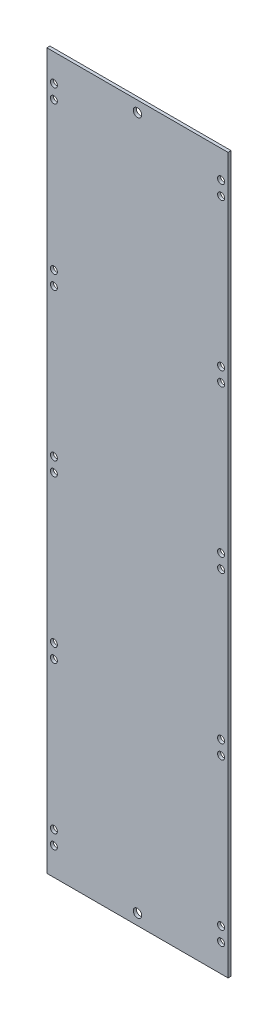
ISO-10303-21;
HEADER;
FILE_DESCRIPTION(('STEP AP214'),'2;1');
FILE_NAME('part.step','',(''),(''),'','','');
FILE_SCHEMA(('AUTOMOTIVE_DESIGN { 1 0 10303 214 1 1 1 1 }'));
ENDSEC;
DATA;
#1=APPLICATION_CONTEXT('core data for automotive mechanical design processes');
#2=APPLICATION_PROTOCOL_DEFINITION('international standard','automotive_design',2000,#1);
#3=PRODUCT_CONTEXT('',#1,'mechanical');
#4=PRODUCT('Part','Part','',(#3));
#5=PRODUCT_RELATED_PRODUCT_CATEGORY('part','',(#4));
#6=PRODUCT_DEFINITION_FORMATION('','',#4);
#7=PRODUCT_DEFINITION_CONTEXT('part definition',#1,'design');
#8=PRODUCT_DEFINITION('design','',#6,#7);
#9=PRODUCT_DEFINITION_SHAPE('','',#8);
#10=(LENGTH_UNIT() NAMED_UNIT(*) SI_UNIT(.MILLI.,.METRE.));
#11=(NAMED_UNIT(*) PLANE_ANGLE_UNIT() SI_UNIT($,.RADIAN.));
#12=(NAMED_UNIT(*) SI_UNIT($,.STERADIAN.) SOLID_ANGLE_UNIT());
#13=UNCERTAINTY_MEASURE_WITH_UNIT(LENGTH_MEASURE(1.E-05),#10,'distance_accuracy_value','');
#14=(GEOMETRIC_REPRESENTATION_CONTEXT(3) GLOBAL_UNCERTAINTY_ASSIGNED_CONTEXT((#13)) GLOBAL_UNIT_ASSIGNED_CONTEXT((#10,
#11,#12)) REPRESENTATION_CONTEXT('',''));
#15=CARTESIAN_POINT('',(0.,0.,0.));
#16=DIRECTION('',(0.,0.,1.));
#17=DIRECTION('',(1.,0.,0.));
#18=AXIS2_PLACEMENT_3D('',#15,#16,#17);
#19=CARTESIAN_POINT('',(0.,0.,1.397));
#20=DIRECTION('',(1.,0.,0.));
#21=DIRECTION('',(0.,0.,-1.));
#22=AXIS2_PLACEMENT_3D('',#19,#20,#21);
#23=PLANE('',#22);
#24=DIRECTION('',(0.,-1.,0.));
#25=VECTOR('',#24,1.);
#26=CARTESIAN_POINT('',(0.,0.,0.));
#27=LINE('',#26,#25);
#28=CARTESIAN_POINT('',(0.,327.5,0.));
#29=VERTEX_POINT('',#28);
#30=CARTESIAN_POINT('',(0.,0.,0.));
#31=VERTEX_POINT('',#30);
#32=EDGE_CURVE('E98',#29,#31,#27,.T.);
#33=ORIENTED_EDGE('',*,*,#32,.T.);
#34=DIRECTION('',(0.,0.,-1.));
#35=VECTOR('',#34,1.);
#36=CARTESIAN_POINT('',(0.,0.,1.397));
#37=LINE('',#36,#35);
#38=CARTESIAN_POINT('',(0.,0.,1.397));
#39=VERTEX_POINT('',#38);
#40=EDGE_CURVE('E11',#39,#31,#37,.T.);
#41=ORIENTED_EDGE('',*,*,#40,.F.);
#42=DIRECTION('',(0.,-1.,0.));
#43=VECTOR('',#42,1.);
#44=CARTESIAN_POINT('',(0.,0.,1.397));
#45=LINE('',#44,#43);
#46=CARTESIAN_POINT('',(0.,327.5,1.397));
#47=VERTEX_POINT('',#46);
#48=EDGE_CURVE('E86',#47,#39,#45,.T.);
#49=ORIENTED_EDGE('',*,*,#48,.F.);
#50=DIRECTION('',(0.,0.,-1.));
#51=VECTOR('',#50,1.);
#52=CARTESIAN_POINT('',(0.,327.5,1.397));
#53=LINE('',#52,#51);
#54=EDGE_CURVE('E94',#47,#29,#53,.T.);
#55=ORIENTED_EDGE('',*,*,#54,.T.);
#56=EDGE_LOOP('',(#33,#41,#49,#55));
#57=FACE_BOUND('',#56,.T.);
#58=ADVANCED_FACE('F35',(#57),#23,.F.);
#59=CARTESIAN_POINT('',(0.,0.,1.397));
#60=DIRECTION('',(0.,1.,0.));
#61=DIRECTION('',(0.,0.,1.));
#62=AXIS2_PLACEMENT_3D('',#59,#60,#61);
#63=PLANE('',#62);
#64=DIRECTION('',(1.,0.,0.));
#65=VECTOR('',#64,1.);
#66=CARTESIAN_POINT('',(0.,0.,0.));
#67=LINE('',#66,#65);
#68=CARTESIAN_POINT('',(83.,0.,0.));
#69=VERTEX_POINT('',#68);
#70=EDGE_CURVE('E90',#31,#69,#67,.T.);
#71=ORIENTED_EDGE('',*,*,#70,.T.);
#72=DIRECTION('',(0.,0.,-1.));
#73=VECTOR('',#72,1.);
#74=CARTESIAN_POINT('',(83.,0.,1.397));
#75=LINE('',#74,#73);
#76=CARTESIAN_POINT('',(83.,0.,1.397));
#77=VERTEX_POINT('',#76);
#78=EDGE_CURVE('E43',#77,#69,#75,.T.);
#79=ORIENTED_EDGE('',*,*,#78,.F.);
#80=DIRECTION('',(1.,0.,0.));
#81=VECTOR('',#80,1.);
#82=CARTESIAN_POINT('',(0.,0.,1.397));
#83=LINE('',#82,#81);
#84=EDGE_CURVE('E81',#39,#77,#83,.T.);
#85=ORIENTED_EDGE('',*,*,#84,.F.);
#86=ORIENTED_EDGE('',*,*,#40,.T.);
#87=EDGE_LOOP('',(#71,#79,#85,#86));
#88=FACE_BOUND('',#87,.T.);
#89=ADVANCED_FACE('F89',(#88),#63,.F.);
#90=CARTESIAN_POINT('',(83.,0.,1.397));
#91=DIRECTION('',(-1.,0.,0.));
#92=DIRECTION('',(0.,0.,1.));
#93=AXIS2_PLACEMENT_3D('',#90,#91,#92);
#94=PLANE('',#93);
#95=DIRECTION('',(0.,1.,0.));
#96=VECTOR('',#95,1.);
#97=CARTESIAN_POINT('',(83.,0.,0.));
#98=LINE('',#97,#96);
#99=CARTESIAN_POINT('',(83.,327.5,0.));
#100=VERTEX_POINT('',#99);
#101=EDGE_CURVE('E68',#69,#100,#98,.T.);
#102=ORIENTED_EDGE('',*,*,#101,.T.);
#103=DIRECTION('',(0.,0.,-1.));
#104=VECTOR('',#103,1.);
#105=CARTESIAN_POINT('',(83.,327.5,1.397));
#106=LINE('',#105,#104);
#107=CARTESIAN_POINT('',(83.,327.5,1.397));
#108=VERTEX_POINT('',#107);
#109=EDGE_CURVE('E91',#108,#100,#106,.T.);
#110=ORIENTED_EDGE('',*,*,#109,.F.);
#111=DIRECTION('',(0.,1.,0.));
#112=VECTOR('',#111,1.);
#113=CARTESIAN_POINT('',(83.,0.,1.397));
#114=LINE('',#113,#112);
#115=EDGE_CURVE('E84',#77,#108,#114,.T.);
#116=ORIENTED_EDGE('',*,*,#115,.F.);
#117=ORIENTED_EDGE('',*,*,#78,.T.);
#118=EDGE_LOOP('',(#102,#110,#116,#117));
#119=FACE_BOUND('',#118,.T.);
#120=ADVANCED_FACE('F92',(#119),#94,.F.);
#121=CARTESIAN_POINT('',(0.,327.5,1.397));
#122=DIRECTION('',(0.,-1.,0.));
#123=DIRECTION('',(0.,0.,-1.));
#124=AXIS2_PLACEMENT_3D('',#121,#122,#123);
#125=PLANE('',#124);
#126=DIRECTION('',(-1.,0.,0.));
#127=VECTOR('',#126,1.);
#128=CARTESIAN_POINT('',(0.,327.5,0.));
#129=LINE('',#128,#127);
#130=EDGE_CURVE('E74',#100,#29,#129,.T.);
#131=ORIENTED_EDGE('',*,*,#130,.T.);
#132=ORIENTED_EDGE('',*,*,#54,.F.);
#133=DIRECTION('',(-1.,0.,0.));
#134=VECTOR('',#133,1.);
#135=CARTESIAN_POINT('',(0.,327.5,1.397));
#136=LINE('',#135,#134);
#137=EDGE_CURVE('E51',#108,#47,#136,.T.);
#138=ORIENTED_EDGE('',*,*,#137,.F.);
#139=ORIENTED_EDGE('',*,*,#109,.T.);
#140=EDGE_LOOP('',(#131,#132,#138,#139));
#141=FACE_BOUND('',#140,.T.);
#142=ADVANCED_FACE('F106',(#141),#125,.F.);
#143=CARTESIAN_POINT('',(0.,0.,1.397));
#144=DIRECTION('',(0.,0.,-1.));
#145=DIRECTION('',(-1.,0.,0.));
#146=AXIS2_PLACEMENT_3D('',#143,#144,#145);
#147=PLANE('',#146);
#148=CARTESIAN_POINT('',(41.5,4.97599999999998,1.397));
#149=DIRECTION('',(0.,0.,1.));
#150=DIRECTION('',(1.,0.,0.));
#151=AXIS2_PLACEMENT_3D('',#148,#149,#150);
#152=CIRCLE('',#151,1.93);
#153=CARTESIAN_POINT('',(43.43,4.97599999999998,1.397));
#154=VERTEX_POINT('',#153);
#155=EDGE_CURVE('E238',#154,#154,#152,.T.);
#156=ORIENTED_EDGE('',*,*,#155,.F.);
#157=EDGE_LOOP('',(#156));
#158=FACE_BOUND('',#157,.T.);
#159=CARTESIAN_POINT('',(41.5,322.524,1.397));
#160=DIRECTION('',(0.,0.,1.));
#161=DIRECTION('',(1.,0.,0.));
#162=AXIS2_PLACEMENT_3D('',#159,#160,#161);
#163=CIRCLE('',#162,1.93);
#164=CARTESIAN_POINT('',(43.43,322.524,1.397));
#165=VERTEX_POINT('',#164);
#166=EDGE_CURVE('E232',#165,#165,#163,.T.);
#167=ORIENTED_EDGE('',*,*,#166,.F.);
#168=EDGE_LOOP('',(#167));
#169=FACE_BOUND('',#168,.T.);
#170=CARTESIAN_POINT('',(79.8000000000031,12.5999999999999,1.397));
#171=DIRECTION('',(0.,0.,1.));
#172=DIRECTION('',(1.,0.,0.));
#173=AXIS2_PLACEMENT_3D('',#170,#171,#172);
#174=CIRCLE('',#173,1.6);
#175=CARTESIAN_POINT('',(81.4000000000031,12.5999999999999,1.397));
#176=VERTEX_POINT('',#175);
#177=EDGE_CURVE('E226',#176,#176,#174,.T.);
#178=ORIENTED_EDGE('',*,*,#177,.F.);
#179=EDGE_LOOP('',(#178));
#180=FACE_BOUND('',#179,.T.);
#181=CARTESIAN_POINT('',(79.8000000000031,19.,1.397));
#182=DIRECTION('',(0.,0.,1.));
#183=DIRECTION('',(1.,0.,0.));
#184=AXIS2_PLACEMENT_3D('',#181,#182,#183);
#185=CIRCLE('',#184,1.6);
#186=CARTESIAN_POINT('',(81.4000000000031,19.,1.397));
#187=VERTEX_POINT('',#186);
#188=EDGE_CURVE('E220',#187,#187,#185,.T.);
#189=ORIENTED_EDGE('',*,*,#188,.F.);
#190=EDGE_LOOP('',(#189));
#191=FACE_BOUND('',#190,.T.);
#192=CARTESIAN_POINT('',(3.2000000000031,12.5999999999999,1.397));
#193=DIRECTION('',(0.,0.,1.));
#194=DIRECTION('',(1.,0.,0.));
#195=AXIS2_PLACEMENT_3D('',#192,#193,#194);
#196=CIRCLE('',#195,1.59999999999999);
#197=CARTESIAN_POINT('',(4.80000000000309,12.5999999999999,1.397));
#198=VERTEX_POINT('',#197);
#199=EDGE_CURVE('E214',#198,#198,#196,.T.);
#200=ORIENTED_EDGE('',*,*,#199,.F.);
#201=EDGE_LOOP('',(#200));
#202=FACE_BOUND('',#201,.T.);
#203=CARTESIAN_POINT('',(3.2000000000031,19.,1.397));
#204=DIRECTION('',(0.,0.,1.));
#205=DIRECTION('',(1.,0.,0.));
#206=AXIS2_PLACEMENT_3D('',#203,#204,#205);
#207=CIRCLE('',#206,1.59999999999999);
#208=CARTESIAN_POINT('',(4.80000000000309,19.,1.397));
#209=VERTEX_POINT('',#208);
#210=EDGE_CURVE('E208',#209,#209,#207,.T.);
#211=ORIENTED_EDGE('',*,*,#210,.F.);
#212=EDGE_LOOP('',(#211));
#213=FACE_BOUND('',#212,.T.);
#214=CARTESIAN_POINT('',(79.8000000000023,86.575,1.397));
#215=DIRECTION('',(0.,0.,1.));
#216=DIRECTION('',(1.,0.,0.));
#217=AXIS2_PLACEMENT_3D('',#214,#215,#216);
#218=CIRCLE('',#217,1.6);
#219=CARTESIAN_POINT('',(81.4000000000023,86.575,1.397));
#220=VERTEX_POINT('',#219);
#221=EDGE_CURVE('E202',#220,#220,#218,.T.);
#222=ORIENTED_EDGE('',*,*,#221,.F.);
#223=EDGE_LOOP('',(#222));
#224=FACE_BOUND('',#223,.T.);
#225=CARTESIAN_POINT('',(79.8000000000023,92.975,1.397));
#226=DIRECTION('',(0.,0.,1.));
#227=DIRECTION('',(1.,0.,0.));
#228=AXIS2_PLACEMENT_3D('',#225,#226,#227);
#229=CIRCLE('',#228,1.6);
#230=CARTESIAN_POINT('',(81.4000000000023,92.975,1.397));
#231=VERTEX_POINT('',#230);
#232=EDGE_CURVE('E196',#231,#231,#229,.T.);
#233=ORIENTED_EDGE('',*,*,#232,.F.);
#234=EDGE_LOOP('',(#233));
#235=FACE_BOUND('',#234,.T.);
#236=CARTESIAN_POINT('',(3.20000000000232,86.575,1.397));
#237=DIRECTION('',(0.,0.,1.));
#238=DIRECTION('',(1.,0.,0.));
#239=AXIS2_PLACEMENT_3D('',#236,#237,#238);
#240=CIRCLE('',#239,1.59999999999999);
#241=CARTESIAN_POINT('',(4.80000000000232,86.575,1.397));
#242=VERTEX_POINT('',#241);
#243=EDGE_CURVE('E190',#242,#242,#240,.T.);
#244=ORIENTED_EDGE('',*,*,#243,.F.);
#245=EDGE_LOOP('',(#244));
#246=FACE_BOUND('',#245,.T.);
#247=CARTESIAN_POINT('',(3.20000000000232,92.975,1.397));
#248=DIRECTION('',(0.,0.,1.));
#249=DIRECTION('',(1.,0.,0.));
#250=AXIS2_PLACEMENT_3D('',#247,#248,#249);
#251=CIRCLE('',#250,1.59999999999999);
#252=CARTESIAN_POINT('',(4.80000000000232,92.975,1.397));
#253=VERTEX_POINT('',#252);
#254=EDGE_CURVE('E184',#253,#253,#251,.T.);
#255=ORIENTED_EDGE('',*,*,#254,.F.);
#256=EDGE_LOOP('',(#255));
#257=FACE_BOUND('',#256,.T.);
#258=CARTESIAN_POINT('',(79.8000000000015,160.55,1.397));
#259=DIRECTION('',(0.,0.,1.));
#260=DIRECTION('',(1.,0.,0.));
#261=AXIS2_PLACEMENT_3D('',#258,#259,#260);
#262=CIRCLE('',#261,1.6);
#263=CARTESIAN_POINT('',(81.4000000000015,160.55,1.397));
#264=VERTEX_POINT('',#263);
#265=EDGE_CURVE('E178',#264,#264,#262,.T.);
#266=ORIENTED_EDGE('',*,*,#265,.F.);
#267=EDGE_LOOP('',(#266));
#268=FACE_BOUND('',#267,.T.);
#269=CARTESIAN_POINT('',(79.8000000000015,166.95,1.397));
#270=DIRECTION('',(0.,0.,1.));
#271=DIRECTION('',(1.,0.,0.));
#272=AXIS2_PLACEMENT_3D('',#269,#270,#271);
#273=CIRCLE('',#272,1.6);
#274=CARTESIAN_POINT('',(81.4000000000015,166.95,1.397));
#275=VERTEX_POINT('',#274);
#276=EDGE_CURVE('E172',#275,#275,#273,.T.);
#277=ORIENTED_EDGE('',*,*,#276,.F.);
#278=EDGE_LOOP('',(#277));
#279=FACE_BOUND('',#278,.T.);
#280=CARTESIAN_POINT('',(3.20000000000155,160.55,1.397));
#281=DIRECTION('',(0.,0.,1.));
#282=DIRECTION('',(1.,0.,0.));
#283=AXIS2_PLACEMENT_3D('',#280,#281,#282);
#284=CIRCLE('',#283,1.59999999999999);
#285=CARTESIAN_POINT('',(4.80000000000154,160.55,1.397));
#286=VERTEX_POINT('',#285);
#287=EDGE_CURVE('E166',#286,#286,#284,.T.);
#288=ORIENTED_EDGE('',*,*,#287,.F.);
#289=EDGE_LOOP('',(#288));
#290=FACE_BOUND('',#289,.T.);
#291=CARTESIAN_POINT('',(3.20000000000155,166.95,1.397));
#292=DIRECTION('',(0.,0.,1.));
#293=DIRECTION('',(1.,0.,0.));
#294=AXIS2_PLACEMENT_3D('',#291,#292,#293);
#295=CIRCLE('',#294,1.59999999999999);
#296=CARTESIAN_POINT('',(4.80000000000154,166.95,1.397));
#297=VERTEX_POINT('',#296);
#298=EDGE_CURVE('E160',#297,#297,#295,.T.);
#299=ORIENTED_EDGE('',*,*,#298,.F.);
#300=EDGE_LOOP('',(#299));
#301=FACE_BOUND('',#300,.T.);
#302=CARTESIAN_POINT('',(79.8000000000008,234.525,1.397));
#303=DIRECTION('',(0.,0.,1.));
#304=DIRECTION('',(1.,0.,0.));
#305=AXIS2_PLACEMENT_3D('',#302,#303,#304);
#306=CIRCLE('',#305,1.6);
#307=CARTESIAN_POINT('',(81.4000000000008,234.525,1.397));
#308=VERTEX_POINT('',#307);
#309=EDGE_CURVE('E154',#308,#308,#306,.T.);
#310=ORIENTED_EDGE('',*,*,#309,.F.);
#311=EDGE_LOOP('',(#310));
#312=FACE_BOUND('',#311,.T.);
#313=CARTESIAN_POINT('',(79.8000000000008,240.925,1.397));
#314=DIRECTION('',(0.,0.,1.));
#315=DIRECTION('',(1.,0.,0.));
#316=AXIS2_PLACEMENT_3D('',#313,#314,#315);
#317=CIRCLE('',#316,1.6);
#318=CARTESIAN_POINT('',(81.4000000000008,240.925,1.397));
#319=VERTEX_POINT('',#318);
#320=EDGE_CURVE('E148',#319,#319,#317,.T.);
#321=ORIENTED_EDGE('',*,*,#320,.F.);
#322=EDGE_LOOP('',(#321));
#323=FACE_BOUND('',#322,.T.);
#324=CARTESIAN_POINT('',(3.20000000000077,234.525,1.397));
#325=DIRECTION('',(0.,0.,1.));
#326=DIRECTION('',(1.,0.,0.));
#327=AXIS2_PLACEMENT_3D('',#324,#325,#326);
#328=CIRCLE('',#327,1.59999999999999);
#329=CARTESIAN_POINT('',(4.80000000000077,234.525,1.397));
#330=VERTEX_POINT('',#329);
#331=EDGE_CURVE('E142',#330,#330,#328,.T.);
#332=ORIENTED_EDGE('',*,*,#331,.F.);
#333=EDGE_LOOP('',(#332));
#334=FACE_BOUND('',#333,.T.);
#335=CARTESIAN_POINT('',(3.20000000000078,240.925,1.397));
#336=DIRECTION('',(0.,0.,1.));
#337=DIRECTION('',(1.,0.,0.));
#338=AXIS2_PLACEMENT_3D('',#335,#336,#337);
#339=CIRCLE('',#338,1.59999999999999);
#340=CARTESIAN_POINT('',(4.80000000000077,240.925,1.397));
#341=VERTEX_POINT('',#340);
#342=EDGE_CURVE('E136',#341,#341,#339,.T.);
#343=ORIENTED_EDGE('',*,*,#342,.F.);
#344=EDGE_LOOP('',(#343));
#345=FACE_BOUND('',#344,.T.);
#346=CARTESIAN_POINT('',(79.8,308.5,1.397));
#347=DIRECTION('',(0.,0.,1.));
#348=DIRECTION('',(1.,0.,0.));
#349=AXIS2_PLACEMENT_3D('',#346,#347,#348);
#350=CIRCLE('',#349,1.6);
#351=CARTESIAN_POINT('',(81.4,308.5,1.397));
#352=VERTEX_POINT('',#351);
#353=EDGE_CURVE('E130',#352,#352,#350,.T.);
#354=ORIENTED_EDGE('',*,*,#353,.F.);
#355=EDGE_LOOP('',(#354));
#356=FACE_BOUND('',#355,.T.);
#357=CARTESIAN_POINT('',(79.8,314.9,1.397));
#358=DIRECTION('',(0.,0.,1.));
#359=DIRECTION('',(1.,0.,0.));
#360=AXIS2_PLACEMENT_3D('',#357,#358,#359);
#361=CIRCLE('',#360,1.6);
#362=CARTESIAN_POINT('',(81.4,314.9,1.397));
#363=VERTEX_POINT('',#362);
#364=EDGE_CURVE('E124',#363,#363,#361,.T.);
#365=ORIENTED_EDGE('',*,*,#364,.F.);
#366=EDGE_LOOP('',(#365));
#367=FACE_BOUND('',#366,.T.);
#368=CARTESIAN_POINT('',(3.2,308.5,1.397));
#369=DIRECTION('',(0.,0.,1.));
#370=DIRECTION('',(1.,0.,0.));
#371=AXIS2_PLACEMENT_3D('',#368,#369,#370);
#372=CIRCLE('',#371,1.59999999999999);
#373=CARTESIAN_POINT('',(4.79999999999999,308.5,1.397));
#374=VERTEX_POINT('',#373);
#375=EDGE_CURVE('E118',#374,#374,#372,.T.);
#376=ORIENTED_EDGE('',*,*,#375,.F.);
#377=EDGE_LOOP('',(#376));
#378=FACE_BOUND('',#377,.T.);
#379=CARTESIAN_POINT('',(3.2,314.9,1.397));
#380=DIRECTION('',(0.,0.,1.));
#381=DIRECTION('',(1.,0.,0.));
#382=AXIS2_PLACEMENT_3D('',#379,#380,#381);
#383=CIRCLE('',#382,1.59999999999999);
#384=CARTESIAN_POINT('',(4.79999999999999,314.9,1.397));
#385=VERTEX_POINT('',#384);
#386=EDGE_CURVE('E112',#385,#385,#383,.T.);
#387=ORIENTED_EDGE('',*,*,#386,.F.);
#388=EDGE_LOOP('',(#387));
#389=FACE_BOUND('',#388,.T.);
#390=ORIENTED_EDGE('',*,*,#48,.T.);
#391=ORIENTED_EDGE('',*,*,#84,.T.);
#392=ORIENTED_EDGE('',*,*,#115,.T.);
#393=ORIENTED_EDGE('',*,*,#137,.T.);
#394=EDGE_LOOP('',(#390,#391,#392,#393));
#395=FACE_BOUND('',#394,.T.);
#396=ADVANCED_FACE('F82',(#158,#169,#180,#191,#202,#213,#224,#235,#246,#257,#268,#279,#290,#301,
#312,#323,#334,#345,#356,#367,#378,#389,#395),#147,.F.);
#397=CARTESIAN_POINT('',(0.,0.,0.));
#398=DIRECTION('',(0.,0.,-1.));
#399=DIRECTION('',(-1.,0.,0.));
#400=AXIS2_PLACEMENT_3D('',#397,#398,#399);
#401=PLANE('',#400);
#402=CARTESIAN_POINT('',(41.5,4.97599999999998,0.));
#403=DIRECTION('',(0.,0.,1.));
#404=DIRECTION('',(1.,0.,0.));
#405=AXIS2_PLACEMENT_3D('',#402,#403,#404);
#406=CIRCLE('',#405,1.93);
#407=CARTESIAN_POINT('',(43.43,4.97599999999998,0.));
#408=VERTEX_POINT('',#407);
#409=EDGE_CURVE('E235',#408,#408,#406,.T.);
#410=ORIENTED_EDGE('',*,*,#409,.T.);
#411=EDGE_LOOP('',(#410));
#412=FACE_BOUND('',#411,.T.);
#413=CARTESIAN_POINT('',(41.5,322.524,0.));
#414=DIRECTION('',(0.,0.,1.));
#415=DIRECTION('',(1.,0.,0.));
#416=AXIS2_PLACEMENT_3D('',#413,#414,#415);
#417=CIRCLE('',#416,1.93);
#418=CARTESIAN_POINT('',(43.43,322.524,0.));
#419=VERTEX_POINT('',#418);
#420=EDGE_CURVE('E229',#419,#419,#417,.T.);
#421=ORIENTED_EDGE('',*,*,#420,.T.);
#422=EDGE_LOOP('',(#421));
#423=FACE_BOUND('',#422,.T.);
#424=CARTESIAN_POINT('',(79.8000000000031,12.5999999999999,0.));
#425=DIRECTION('',(0.,0.,1.));
#426=DIRECTION('',(1.,0.,0.));
#427=AXIS2_PLACEMENT_3D('',#424,#425,#426);
#428=CIRCLE('',#427,1.6);
#429=CARTESIAN_POINT('',(81.4000000000031,12.5999999999999,0.));
#430=VERTEX_POINT('',#429);
#431=EDGE_CURVE('E223',#430,#430,#428,.T.);
#432=ORIENTED_EDGE('',*,*,#431,.T.);
#433=EDGE_LOOP('',(#432));
#434=FACE_BOUND('',#433,.T.);
#435=CARTESIAN_POINT('',(79.8000000000031,19.,0.));
#436=DIRECTION('',(0.,0.,1.));
#437=DIRECTION('',(1.,0.,0.));
#438=AXIS2_PLACEMENT_3D('',#435,#436,#437);
#439=CIRCLE('',#438,1.6);
#440=CARTESIAN_POINT('',(81.4000000000031,19.,0.));
#441=VERTEX_POINT('',#440);
#442=EDGE_CURVE('E217',#441,#441,#439,.T.);
#443=ORIENTED_EDGE('',*,*,#442,.T.);
#444=EDGE_LOOP('',(#443));
#445=FACE_BOUND('',#444,.T.);
#446=CARTESIAN_POINT('',(3.2000000000031,12.5999999999999,0.));
#447=DIRECTION('',(0.,0.,1.));
#448=DIRECTION('',(1.,0.,0.));
#449=AXIS2_PLACEMENT_3D('',#446,#447,#448);
#450=CIRCLE('',#449,1.59999999999999);
#451=CARTESIAN_POINT('',(4.80000000000309,12.5999999999999,0.));
#452=VERTEX_POINT('',#451);
#453=EDGE_CURVE('E211',#452,#452,#450,.T.);
#454=ORIENTED_EDGE('',*,*,#453,.T.);
#455=EDGE_LOOP('',(#454));
#456=FACE_BOUND('',#455,.T.);
#457=CARTESIAN_POINT('',(3.2000000000031,19.,0.));
#458=DIRECTION('',(0.,0.,1.));
#459=DIRECTION('',(1.,0.,0.));
#460=AXIS2_PLACEMENT_3D('',#457,#458,#459);
#461=CIRCLE('',#460,1.59999999999999);
#462=CARTESIAN_POINT('',(4.80000000000309,19.,0.));
#463=VERTEX_POINT('',#462);
#464=EDGE_CURVE('E205',#463,#463,#461,.T.);
#465=ORIENTED_EDGE('',*,*,#464,.T.);
#466=EDGE_LOOP('',(#465));
#467=FACE_BOUND('',#466,.T.);
#468=CARTESIAN_POINT('',(79.8000000000023,86.575,0.));
#469=DIRECTION('',(0.,0.,1.));
#470=DIRECTION('',(1.,0.,0.));
#471=AXIS2_PLACEMENT_3D('',#468,#469,#470);
#472=CIRCLE('',#471,1.6);
#473=CARTESIAN_POINT('',(81.4000000000023,86.575,0.));
#474=VERTEX_POINT('',#473);
#475=EDGE_CURVE('E199',#474,#474,#472,.T.);
#476=ORIENTED_EDGE('',*,*,#475,.T.);
#477=EDGE_LOOP('',(#476));
#478=FACE_BOUND('',#477,.T.);
#479=CARTESIAN_POINT('',(79.8000000000023,92.975,0.));
#480=DIRECTION('',(0.,0.,1.));
#481=DIRECTION('',(1.,0.,0.));
#482=AXIS2_PLACEMENT_3D('',#479,#480,#481);
#483=CIRCLE('',#482,1.6);
#484=CARTESIAN_POINT('',(81.4000000000023,92.975,0.));
#485=VERTEX_POINT('',#484);
#486=EDGE_CURVE('E193',#485,#485,#483,.T.);
#487=ORIENTED_EDGE('',*,*,#486,.T.);
#488=EDGE_LOOP('',(#487));
#489=FACE_BOUND('',#488,.T.);
#490=CARTESIAN_POINT('',(3.20000000000232,86.575,0.));
#491=DIRECTION('',(0.,0.,1.));
#492=DIRECTION('',(1.,0.,0.));
#493=AXIS2_PLACEMENT_3D('',#490,#491,#492);
#494=CIRCLE('',#493,1.59999999999999);
#495=CARTESIAN_POINT('',(4.80000000000232,86.575,0.));
#496=VERTEX_POINT('',#495);
#497=EDGE_CURVE('E187',#496,#496,#494,.T.);
#498=ORIENTED_EDGE('',*,*,#497,.T.);
#499=EDGE_LOOP('',(#498));
#500=FACE_BOUND('',#499,.T.);
#501=CARTESIAN_POINT('',(3.20000000000232,92.975,0.));
#502=DIRECTION('',(0.,0.,1.));
#503=DIRECTION('',(1.,0.,0.));
#504=AXIS2_PLACEMENT_3D('',#501,#502,#503);
#505=CIRCLE('',#504,1.59999999999999);
#506=CARTESIAN_POINT('',(4.80000000000232,92.975,0.));
#507=VERTEX_POINT('',#506);
#508=EDGE_CURVE('E181',#507,#507,#505,.T.);
#509=ORIENTED_EDGE('',*,*,#508,.T.);
#510=EDGE_LOOP('',(#509));
#511=FACE_BOUND('',#510,.T.);
#512=CARTESIAN_POINT('',(79.8000000000015,160.55,0.));
#513=DIRECTION('',(0.,0.,1.));
#514=DIRECTION('',(1.,0.,0.));
#515=AXIS2_PLACEMENT_3D('',#512,#513,#514);
#516=CIRCLE('',#515,1.6);
#517=CARTESIAN_POINT('',(81.4000000000015,160.55,0.));
#518=VERTEX_POINT('',#517);
#519=EDGE_CURVE('E175',#518,#518,#516,.T.);
#520=ORIENTED_EDGE('',*,*,#519,.T.);
#521=EDGE_LOOP('',(#520));
#522=FACE_BOUND('',#521,.T.);
#523=CARTESIAN_POINT('',(79.8000000000015,166.95,0.));
#524=DIRECTION('',(0.,0.,1.));
#525=DIRECTION('',(1.,0.,0.));
#526=AXIS2_PLACEMENT_3D('',#523,#524,#525);
#527=CIRCLE('',#526,1.6);
#528=CARTESIAN_POINT('',(81.4000000000015,166.95,0.));
#529=VERTEX_POINT('',#528);
#530=EDGE_CURVE('E169',#529,#529,#527,.T.);
#531=ORIENTED_EDGE('',*,*,#530,.T.);
#532=EDGE_LOOP('',(#531));
#533=FACE_BOUND('',#532,.T.);
#534=CARTESIAN_POINT('',(3.20000000000155,160.55,0.));
#535=DIRECTION('',(0.,0.,1.));
#536=DIRECTION('',(1.,0.,0.));
#537=AXIS2_PLACEMENT_3D('',#534,#535,#536);
#538=CIRCLE('',#537,1.59999999999999);
#539=CARTESIAN_POINT('',(4.80000000000154,160.55,0.));
#540=VERTEX_POINT('',#539);
#541=EDGE_CURVE('E163',#540,#540,#538,.T.);
#542=ORIENTED_EDGE('',*,*,#541,.T.);
#543=EDGE_LOOP('',(#542));
#544=FACE_BOUND('',#543,.T.);
#545=CARTESIAN_POINT('',(3.20000000000155,166.95,0.));
#546=DIRECTION('',(0.,0.,1.));
#547=DIRECTION('',(1.,0.,0.));
#548=AXIS2_PLACEMENT_3D('',#545,#546,#547);
#549=CIRCLE('',#548,1.59999999999999);
#550=CARTESIAN_POINT('',(4.80000000000154,166.95,0.));
#551=VERTEX_POINT('',#550);
#552=EDGE_CURVE('E157',#551,#551,#549,.T.);
#553=ORIENTED_EDGE('',*,*,#552,.T.);
#554=EDGE_LOOP('',(#553));
#555=FACE_BOUND('',#554,.T.);
#556=CARTESIAN_POINT('',(79.8000000000008,234.525,0.));
#557=DIRECTION('',(0.,0.,1.));
#558=DIRECTION('',(1.,0.,0.));
#559=AXIS2_PLACEMENT_3D('',#556,#557,#558);
#560=CIRCLE('',#559,1.6);
#561=CARTESIAN_POINT('',(81.4000000000008,234.525,0.));
#562=VERTEX_POINT('',#561);
#563=EDGE_CURVE('E151',#562,#562,#560,.T.);
#564=ORIENTED_EDGE('',*,*,#563,.T.);
#565=EDGE_LOOP('',(#564));
#566=FACE_BOUND('',#565,.T.);
#567=CARTESIAN_POINT('',(79.8000000000008,240.925,0.));
#568=DIRECTION('',(0.,0.,1.));
#569=DIRECTION('',(1.,0.,0.));
#570=AXIS2_PLACEMENT_3D('',#567,#568,#569);
#571=CIRCLE('',#570,1.6);
#572=CARTESIAN_POINT('',(81.4000000000008,240.925,0.));
#573=VERTEX_POINT('',#572);
#574=EDGE_CURVE('E145',#573,#573,#571,.T.);
#575=ORIENTED_EDGE('',*,*,#574,.T.);
#576=EDGE_LOOP('',(#575));
#577=FACE_BOUND('',#576,.T.);
#578=CARTESIAN_POINT('',(3.20000000000077,234.525,0.));
#579=DIRECTION('',(0.,0.,1.));
#580=DIRECTION('',(1.,0.,0.));
#581=AXIS2_PLACEMENT_3D('',#578,#579,#580);
#582=CIRCLE('',#581,1.59999999999999);
#583=CARTESIAN_POINT('',(4.80000000000077,234.525,0.));
#584=VERTEX_POINT('',#583);
#585=EDGE_CURVE('E139',#584,#584,#582,.T.);
#586=ORIENTED_EDGE('',*,*,#585,.T.);
#587=EDGE_LOOP('',(#586));
#588=FACE_BOUND('',#587,.T.);
#589=CARTESIAN_POINT('',(3.20000000000078,240.925,0.));
#590=DIRECTION('',(0.,0.,1.));
#591=DIRECTION('',(1.,0.,0.));
#592=AXIS2_PLACEMENT_3D('',#589,#590,#591);
#593=CIRCLE('',#592,1.59999999999999);
#594=CARTESIAN_POINT('',(4.80000000000077,240.925,0.));
#595=VERTEX_POINT('',#594);
#596=EDGE_CURVE('E133',#595,#595,#593,.T.);
#597=ORIENTED_EDGE('',*,*,#596,.T.);
#598=EDGE_LOOP('',(#597));
#599=FACE_BOUND('',#598,.T.);
#600=CARTESIAN_POINT('',(79.8,308.5,0.));
#601=DIRECTION('',(0.,0.,1.));
#602=DIRECTION('',(1.,0.,0.));
#603=AXIS2_PLACEMENT_3D('',#600,#601,#602);
#604=CIRCLE('',#603,1.6);
#605=CARTESIAN_POINT('',(81.4,308.5,0.));
#606=VERTEX_POINT('',#605);
#607=EDGE_CURVE('E127',#606,#606,#604,.T.);
#608=ORIENTED_EDGE('',*,*,#607,.T.);
#609=EDGE_LOOP('',(#608));
#610=FACE_BOUND('',#609,.T.);
#611=CARTESIAN_POINT('',(79.8,314.9,0.));
#612=DIRECTION('',(0.,0.,1.));
#613=DIRECTION('',(1.,0.,0.));
#614=AXIS2_PLACEMENT_3D('',#611,#612,#613);
#615=CIRCLE('',#614,1.6);
#616=CARTESIAN_POINT('',(81.4,314.9,0.));
#617=VERTEX_POINT('',#616);
#618=EDGE_CURVE('E121',#617,#617,#615,.T.);
#619=ORIENTED_EDGE('',*,*,#618,.T.);
#620=EDGE_LOOP('',(#619));
#621=FACE_BOUND('',#620,.T.);
#622=CARTESIAN_POINT('',(3.2,308.5,0.));
#623=DIRECTION('',(0.,0.,1.));
#624=DIRECTION('',(1.,0.,0.));
#625=AXIS2_PLACEMENT_3D('',#622,#623,#624);
#626=CIRCLE('',#625,1.59999999999999);
#627=CARTESIAN_POINT('',(4.79999999999999,308.5,0.));
#628=VERTEX_POINT('',#627);
#629=EDGE_CURVE('E115',#628,#628,#626,.T.);
#630=ORIENTED_EDGE('',*,*,#629,.T.);
#631=EDGE_LOOP('',(#630));
#632=FACE_BOUND('',#631,.T.);
#633=CARTESIAN_POINT('',(3.2,314.9,0.));
#634=DIRECTION('',(0.,0.,1.));
#635=DIRECTION('',(1.,0.,0.));
#636=AXIS2_PLACEMENT_3D('',#633,#634,#635);
#637=CIRCLE('',#636,1.59999999999999);
#638=CARTESIAN_POINT('',(4.79999999999999,314.9,0.));
#639=VERTEX_POINT('',#638);
#640=EDGE_CURVE('E101',#639,#639,#637,.T.);
#641=ORIENTED_EDGE('',*,*,#640,.T.);
#642=EDGE_LOOP('',(#641));
#643=FACE_BOUND('',#642,.T.);
#644=ORIENTED_EDGE('',*,*,#32,.F.);
#645=ORIENTED_EDGE('',*,*,#130,.F.);
#646=ORIENTED_EDGE('',*,*,#101,.F.);
#647=ORIENTED_EDGE('',*,*,#70,.F.);
#648=EDGE_LOOP('',(#644,#645,#646,#647));
#649=FACE_BOUND('',#648,.T.);
#650=ADVANCED_FACE('F109',(#412,#423,#434,#445,#456,#467,#478,#489,#500,#511,#522,#533,#544,
#555,#566,#577,#588,#599,#610,#621,#632,#643,#649),#401,.T.);
#651=CARTESIAN_POINT('',(3.2,314.9,0.));
#652=DIRECTION('',(0.,0.,1.));
#653=DIRECTION('',(1.,0.,0.));
#654=AXIS2_PLACEMENT_3D('',#651,#652,#653);
#655=CYLINDRICAL_SURFACE('',#654,1.59999999999999);
#656=ORIENTED_EDGE('',*,*,#640,.F.);
#657=EDGE_LOOP('',(#656));
#658=FACE_BOUND('',#657,.T.);
#659=ORIENTED_EDGE('',*,*,#386,.T.);
#660=EDGE_LOOP('',(#659));
#661=FACE_BOUND('',#660,.T.);
#662=ADVANCED_FACE('F298',(#658,#661),#655,.F.);
#663=CARTESIAN_POINT('',(3.2,308.5,0.));
#664=DIRECTION('',(0.,0.,1.));
#665=DIRECTION('',(1.,0.,0.));
#666=AXIS2_PLACEMENT_3D('',#663,#664,#665);
#667=CYLINDRICAL_SURFACE('',#666,1.59999999999999);
#668=ORIENTED_EDGE('',*,*,#629,.F.);
#669=EDGE_LOOP('',(#668));
#670=FACE_BOUND('',#669,.T.);
#671=ORIENTED_EDGE('',*,*,#375,.T.);
#672=EDGE_LOOP('',(#671));
#673=FACE_BOUND('',#672,.T.);
#674=ADVANCED_FACE('F300',(#670,#673),#667,.F.);
#675=CARTESIAN_POINT('',(79.8,314.9,0.));
#676=DIRECTION('',(0.,0.,1.));
#677=DIRECTION('',(1.,0.,0.));
#678=AXIS2_PLACEMENT_3D('',#675,#676,#677);
#679=CYLINDRICAL_SURFACE('',#678,1.6);
#680=ORIENTED_EDGE('',*,*,#618,.F.);
#681=EDGE_LOOP('',(#680));
#682=FACE_BOUND('',#681,.T.);
#683=ORIENTED_EDGE('',*,*,#364,.T.);
#684=EDGE_LOOP('',(#683));
#685=FACE_BOUND('',#684,.T.);
#686=ADVANCED_FACE('F307',(#682,#685),#679,.F.);
#687=CARTESIAN_POINT('',(79.8,308.5,0.));
#688=DIRECTION('',(0.,0.,1.));
#689=DIRECTION('',(1.,0.,0.));
#690=AXIS2_PLACEMENT_3D('',#687,#688,#689);
#691=CYLINDRICAL_SURFACE('',#690,1.6);
#692=ORIENTED_EDGE('',*,*,#607,.F.);
#693=EDGE_LOOP('',(#692));
#694=FACE_BOUND('',#693,.T.);
#695=ORIENTED_EDGE('',*,*,#353,.T.);
#696=EDGE_LOOP('',(#695));
#697=FACE_BOUND('',#696,.T.);
#698=ADVANCED_FACE('F479',(#694,#697),#691,.F.);
#699=CARTESIAN_POINT('',(3.20000000000078,240.925,0.));
#700=DIRECTION('',(0.,0.,1.));
#701=DIRECTION('',(1.,0.,0.));
#702=AXIS2_PLACEMENT_3D('',#699,#700,#701);
#703=CYLINDRICAL_SURFACE('',#702,1.59999999999999);
#704=ORIENTED_EDGE('',*,*,#596,.F.);
#705=EDGE_LOOP('',(#704));
#706=FACE_BOUND('',#705,.T.);
#707=ORIENTED_EDGE('',*,*,#342,.T.);
#708=EDGE_LOOP('',(#707));
#709=FACE_BOUND('',#708,.T.);
#710=ADVANCED_FACE('F471',(#706,#709),#703,.F.);
#711=CARTESIAN_POINT('',(3.20000000000077,234.525,0.));
#712=DIRECTION('',(0.,0.,1.));
#713=DIRECTION('',(1.,0.,0.));
#714=AXIS2_PLACEMENT_3D('',#711,#712,#713);
#715=CYLINDRICAL_SURFACE('',#714,1.59999999999999);
#716=ORIENTED_EDGE('',*,*,#585,.F.);
#717=EDGE_LOOP('',(#716));
#718=FACE_BOUND('',#717,.T.);
#719=ORIENTED_EDGE('',*,*,#331,.T.);
#720=EDGE_LOOP('',(#719));
#721=FACE_BOUND('',#720,.T.);
#722=ADVANCED_FACE('F463',(#718,#721),#715,.F.);
#723=CARTESIAN_POINT('',(79.8000000000008,240.925,0.));
#724=DIRECTION('',(0.,0.,1.));
#725=DIRECTION('',(1.,0.,0.));
#726=AXIS2_PLACEMENT_3D('',#723,#724,#725);
#727=CYLINDRICAL_SURFACE('',#726,1.6);
#728=ORIENTED_EDGE('',*,*,#574,.F.);
#729=EDGE_LOOP('',(#728));
#730=FACE_BOUND('',#729,.T.);
#731=ORIENTED_EDGE('',*,*,#320,.T.);
#732=EDGE_LOOP('',(#731));
#733=FACE_BOUND('',#732,.T.);
#734=ADVANCED_FACE('F455',(#730,#733),#727,.F.);
#735=CARTESIAN_POINT('',(79.8000000000008,234.525,0.));
#736=DIRECTION('',(0.,0.,1.));
#737=DIRECTION('',(1.,0.,0.));
#738=AXIS2_PLACEMENT_3D('',#735,#736,#737);
#739=CYLINDRICAL_SURFACE('',#738,1.6);
#740=ORIENTED_EDGE('',*,*,#563,.F.);
#741=EDGE_LOOP('',(#740));
#742=FACE_BOUND('',#741,.T.);
#743=ORIENTED_EDGE('',*,*,#309,.T.);
#744=EDGE_LOOP('',(#743));
#745=FACE_BOUND('',#744,.T.);
#746=ADVANCED_FACE('F447',(#742,#745),#739,.F.);
#747=CARTESIAN_POINT('',(3.20000000000155,166.95,0.));
#748=DIRECTION('',(0.,0.,1.));
#749=DIRECTION('',(1.,0.,0.));
#750=AXIS2_PLACEMENT_3D('',#747,#748,#749);
#751=CYLINDRICAL_SURFACE('',#750,1.59999999999999);
#752=ORIENTED_EDGE('',*,*,#552,.F.);
#753=EDGE_LOOP('',(#752));
#754=FACE_BOUND('',#753,.T.);
#755=ORIENTED_EDGE('',*,*,#298,.T.);
#756=EDGE_LOOP('',(#755));
#757=FACE_BOUND('',#756,.T.);
#758=ADVANCED_FACE('F439',(#754,#757),#751,.F.);
#759=CARTESIAN_POINT('',(3.20000000000155,160.55,0.));
#760=DIRECTION('',(0.,0.,1.));
#761=DIRECTION('',(1.,0.,0.));
#762=AXIS2_PLACEMENT_3D('',#759,#760,#761);
#763=CYLINDRICAL_SURFACE('',#762,1.59999999999999);
#764=ORIENTED_EDGE('',*,*,#541,.F.);
#765=EDGE_LOOP('',(#764));
#766=FACE_BOUND('',#765,.T.);
#767=ORIENTED_EDGE('',*,*,#287,.T.);
#768=EDGE_LOOP('',(#767));
#769=FACE_BOUND('',#768,.T.);
#770=ADVANCED_FACE('F431',(#766,#769),#763,.F.);
#771=CARTESIAN_POINT('',(79.8000000000015,166.95,0.));
#772=DIRECTION('',(0.,0.,1.));
#773=DIRECTION('',(1.,0.,0.));
#774=AXIS2_PLACEMENT_3D('',#771,#772,#773);
#775=CYLINDRICAL_SURFACE('',#774,1.6);
#776=ORIENTED_EDGE('',*,*,#530,.F.);
#777=EDGE_LOOP('',(#776));
#778=FACE_BOUND('',#777,.T.);
#779=ORIENTED_EDGE('',*,*,#276,.T.);
#780=EDGE_LOOP('',(#779));
#781=FACE_BOUND('',#780,.T.);
#782=ADVANCED_FACE('F423',(#778,#781),#775,.F.);
#783=CARTESIAN_POINT('',(79.8000000000015,160.55,0.));
#784=DIRECTION('',(0.,0.,1.));
#785=DIRECTION('',(1.,0.,0.));
#786=AXIS2_PLACEMENT_3D('',#783,#784,#785);
#787=CYLINDRICAL_SURFACE('',#786,1.6);
#788=ORIENTED_EDGE('',*,*,#519,.F.);
#789=EDGE_LOOP('',(#788));
#790=FACE_BOUND('',#789,.T.);
#791=ORIENTED_EDGE('',*,*,#265,.T.);
#792=EDGE_LOOP('',(#791));
#793=FACE_BOUND('',#792,.T.);
#794=ADVANCED_FACE('F415',(#790,#793),#787,.F.);
#795=CARTESIAN_POINT('',(3.20000000000232,92.975,0.));
#796=DIRECTION('',(0.,0.,1.));
#797=DIRECTION('',(1.,0.,0.));
#798=AXIS2_PLACEMENT_3D('',#795,#796,#797);
#799=CYLINDRICAL_SURFACE('',#798,1.59999999999999);
#800=ORIENTED_EDGE('',*,*,#508,.F.);
#801=EDGE_LOOP('',(#800));
#802=FACE_BOUND('',#801,.T.);
#803=ORIENTED_EDGE('',*,*,#254,.T.);
#804=EDGE_LOOP('',(#803));
#805=FACE_BOUND('',#804,.T.);
#806=ADVANCED_FACE('F407',(#802,#805),#799,.F.);
#807=CARTESIAN_POINT('',(3.20000000000232,86.575,0.));
#808=DIRECTION('',(0.,0.,1.));
#809=DIRECTION('',(1.,0.,0.));
#810=AXIS2_PLACEMENT_3D('',#807,#808,#809);
#811=CYLINDRICAL_SURFACE('',#810,1.59999999999999);
#812=ORIENTED_EDGE('',*,*,#497,.F.);
#813=EDGE_LOOP('',(#812));
#814=FACE_BOUND('',#813,.T.);
#815=ORIENTED_EDGE('',*,*,#243,.T.);
#816=EDGE_LOOP('',(#815));
#817=FACE_BOUND('',#816,.T.);
#818=ADVANCED_FACE('F399',(#814,#817),#811,.F.);
#819=CARTESIAN_POINT('',(79.8000000000023,92.975,0.));
#820=DIRECTION('',(0.,0.,1.));
#821=DIRECTION('',(1.,0.,0.));
#822=AXIS2_PLACEMENT_3D('',#819,#820,#821);
#823=CYLINDRICAL_SURFACE('',#822,1.6);
#824=ORIENTED_EDGE('',*,*,#486,.F.);
#825=EDGE_LOOP('',(#824));
#826=FACE_BOUND('',#825,.T.);
#827=ORIENTED_EDGE('',*,*,#232,.T.);
#828=EDGE_LOOP('',(#827));
#829=FACE_BOUND('',#828,.T.);
#830=ADVANCED_FACE('F391',(#826,#829),#823,.F.);
#831=CARTESIAN_POINT('',(79.8000000000023,86.575,0.));
#832=DIRECTION('',(0.,0.,1.));
#833=DIRECTION('',(1.,0.,0.));
#834=AXIS2_PLACEMENT_3D('',#831,#832,#833);
#835=CYLINDRICAL_SURFACE('',#834,1.6);
#836=ORIENTED_EDGE('',*,*,#475,.F.);
#837=EDGE_LOOP('',(#836));
#838=FACE_BOUND('',#837,.T.);
#839=ORIENTED_EDGE('',*,*,#221,.T.);
#840=EDGE_LOOP('',(#839));
#841=FACE_BOUND('',#840,.T.);
#842=ADVANCED_FACE('F383',(#838,#841),#835,.F.);
#843=CARTESIAN_POINT('',(3.2000000000031,19.,0.));
#844=DIRECTION('',(0.,0.,1.));
#845=DIRECTION('',(1.,0.,0.));
#846=AXIS2_PLACEMENT_3D('',#843,#844,#845);
#847=CYLINDRICAL_SURFACE('',#846,1.59999999999999);
#848=ORIENTED_EDGE('',*,*,#464,.F.);
#849=EDGE_LOOP('',(#848));
#850=FACE_BOUND('',#849,.T.);
#851=ORIENTED_EDGE('',*,*,#210,.T.);
#852=EDGE_LOOP('',(#851));
#853=FACE_BOUND('',#852,.T.);
#854=ADVANCED_FACE('F375',(#850,#853),#847,.F.);
#855=CARTESIAN_POINT('',(3.2000000000031,12.5999999999999,0.));
#856=DIRECTION('',(0.,0.,1.));
#857=DIRECTION('',(1.,0.,0.));
#858=AXIS2_PLACEMENT_3D('',#855,#856,#857);
#859=CYLINDRICAL_SURFACE('',#858,1.59999999999999);
#860=ORIENTED_EDGE('',*,*,#453,.F.);
#861=EDGE_LOOP('',(#860));
#862=FACE_BOUND('',#861,.T.);
#863=ORIENTED_EDGE('',*,*,#199,.T.);
#864=EDGE_LOOP('',(#863));
#865=FACE_BOUND('',#864,.T.);
#866=ADVANCED_FACE('F367',(#862,#865),#859,.F.);
#867=CARTESIAN_POINT('',(79.8000000000031,19.,0.));
#868=DIRECTION('',(0.,0.,1.));
#869=DIRECTION('',(1.,0.,0.));
#870=AXIS2_PLACEMENT_3D('',#867,#868,#869);
#871=CYLINDRICAL_SURFACE('',#870,1.6);
#872=ORIENTED_EDGE('',*,*,#442,.F.);
#873=EDGE_LOOP('',(#872));
#874=FACE_BOUND('',#873,.T.);
#875=ORIENTED_EDGE('',*,*,#188,.T.);
#876=EDGE_LOOP('',(#875));
#877=FACE_BOUND('',#876,.T.);
#878=ADVANCED_FACE('F360',(#874,#877),#871,.F.);
#879=CARTESIAN_POINT('',(79.8000000000031,12.5999999999999,0.));
#880=DIRECTION('',(0.,0.,1.));
#881=DIRECTION('',(1.,0.,0.));
#882=AXIS2_PLACEMENT_3D('',#879,#880,#881);
#883=CYLINDRICAL_SURFACE('',#882,1.6);
#884=ORIENTED_EDGE('',*,*,#431,.F.);
#885=EDGE_LOOP('',(#884));
#886=FACE_BOUND('',#885,.T.);
#887=ORIENTED_EDGE('',*,*,#177,.T.);
#888=EDGE_LOOP('',(#887));
#889=FACE_BOUND('',#888,.T.);
#890=ADVANCED_FACE('F345',(#886,#889),#883,.F.);
#891=CARTESIAN_POINT('',(41.5,322.524,0.));
#892=DIRECTION('',(0.,0.,1.));
#893=DIRECTION('',(1.,0.,0.));
#894=AXIS2_PLACEMENT_3D('',#891,#892,#893);
#895=CYLINDRICAL_SURFACE('',#894,1.93);
#896=ORIENTED_EDGE('',*,*,#420,.F.);
#897=EDGE_LOOP('',(#896));
#898=FACE_BOUND('',#897,.T.);
#899=ORIENTED_EDGE('',*,*,#166,.T.);
#900=EDGE_LOOP('',(#899));
#901=FACE_BOUND('',#900,.T.);
#902=ADVANCED_FACE('F249',(#898,#901),#895,.F.);
#903=CARTESIAN_POINT('',(41.5,4.97599999999998,0.));
#904=DIRECTION('',(0.,0.,1.));
#905=DIRECTION('',(1.,0.,0.));
#906=AXIS2_PLACEMENT_3D('',#903,#904,#905);
#907=CYLINDRICAL_SURFACE('',#906,1.93);
#908=ORIENTED_EDGE('',*,*,#409,.F.);
#909=EDGE_LOOP('',(#908));
#910=FACE_BOUND('',#909,.T.);
#911=ORIENTED_EDGE('',*,*,#155,.T.);
#912=EDGE_LOOP('',(#911));
#913=FACE_BOUND('',#912,.T.);
#914=ADVANCED_FACE('F246',(#910,#913),#907,.F.);
#915=CLOSED_SHELL('',(#58,#89,#120,#142,#396,#650,#662,#674,#686,#698,#710,#722,#734,#746,#758,
#770,#782,#794,#806,#818,#830,#842,#854,#866,#878,#890,#902,#914));
#916=MANIFOLD_SOLID_BREP('B2',#915);
#917=ADVANCED_BREP_SHAPE_REPRESENTATION('',(#18,#916),#14);
#918=SHAPE_DEFINITION_REPRESENTATION(#9,#917);
ENDSEC;
END-ISO-10303-21;
